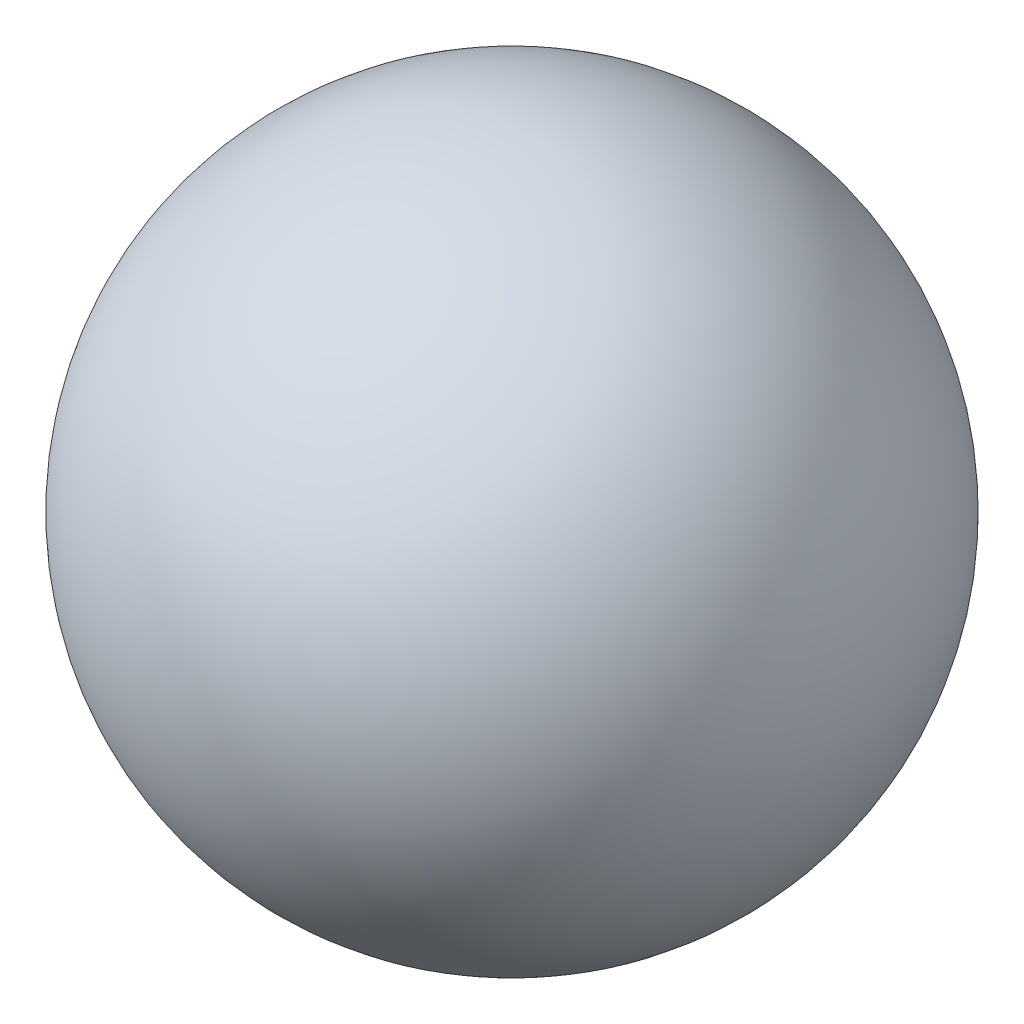
ISO-10303-21;
HEADER;
FILE_DESCRIPTION(('STEP AP214'),'2;1');
FILE_NAME('part.step','',(''),(''),'','','');
FILE_SCHEMA(('AUTOMOTIVE_DESIGN { 1 0 10303 214 1 1 1 1 }'));
ENDSEC;
DATA;
#1=APPLICATION_CONTEXT('core data for automotive mechanical design processes');
#2=APPLICATION_PROTOCOL_DEFINITION('international standard','automotive_design',2000,#1);
#3=PRODUCT_CONTEXT('',#1,'mechanical');
#4=PRODUCT('Part','Part','',(#3));
#5=PRODUCT_RELATED_PRODUCT_CATEGORY('part','',(#4));
#6=PRODUCT_DEFINITION_FORMATION('','',#4);
#7=PRODUCT_DEFINITION_CONTEXT('part definition',#1,'design');
#8=PRODUCT_DEFINITION('design','',#6,#7);
#9=PRODUCT_DEFINITION_SHAPE('','',#8);
#10=(LENGTH_UNIT() NAMED_UNIT(*) SI_UNIT(.MILLI.,.METRE.));
#11=(NAMED_UNIT(*) PLANE_ANGLE_UNIT() SI_UNIT($,.RADIAN.));
#12=(NAMED_UNIT(*) SI_UNIT($,.STERADIAN.) SOLID_ANGLE_UNIT());
#13=UNCERTAINTY_MEASURE_WITH_UNIT(LENGTH_MEASURE(1.E-05),#10,'distance_accuracy_value','');
#14=(GEOMETRIC_REPRESENTATION_CONTEXT(3) GLOBAL_UNCERTAINTY_ASSIGNED_CONTEXT((#13)) GLOBAL_UNIT_ASSIGNED_CONTEXT((#10,
#11,#12)) REPRESENTATION_CONTEXT('',''));
#15=CARTESIAN_POINT('',(0.,0.,0.));
#16=DIRECTION('',(0.,0.,1.));
#17=DIRECTION('',(1.,0.,0.));
#18=AXIS2_PLACEMENT_3D('',#15,#16,#17);
#19=CARTESIAN_POINT('',(0.,0.,0.));
#20=DIRECTION('',(0.,1.,0.));
#21=DIRECTION('',(0.,0.,1.));
#22=AXIS2_PLACEMENT_3D('',#19,#20,#21);
#23=SPHERICAL_SURFACE('',#22,22.225);
#24=CARTESIAN_POINT('',(0.,22.225,0.));
#25=VERTEX_POINT('',#24);
#26=VERTEX_LOOP('',#25);
#27=FACE_BOUND('',#26,.T.);
#28=ADVANCED_FACE('F28',(#27),#23,.T.);
#29=CLOSED_SHELL('',(#28));
#30=MANIFOLD_SOLID_BREP('B2',#29);
#31=ADVANCED_BREP_SHAPE_REPRESENTATION('',(#18,#30),#14);
#32=SHAPE_DEFINITION_REPRESENTATION(#9,#31);
ENDSEC;
END-ISO-10303-21;
